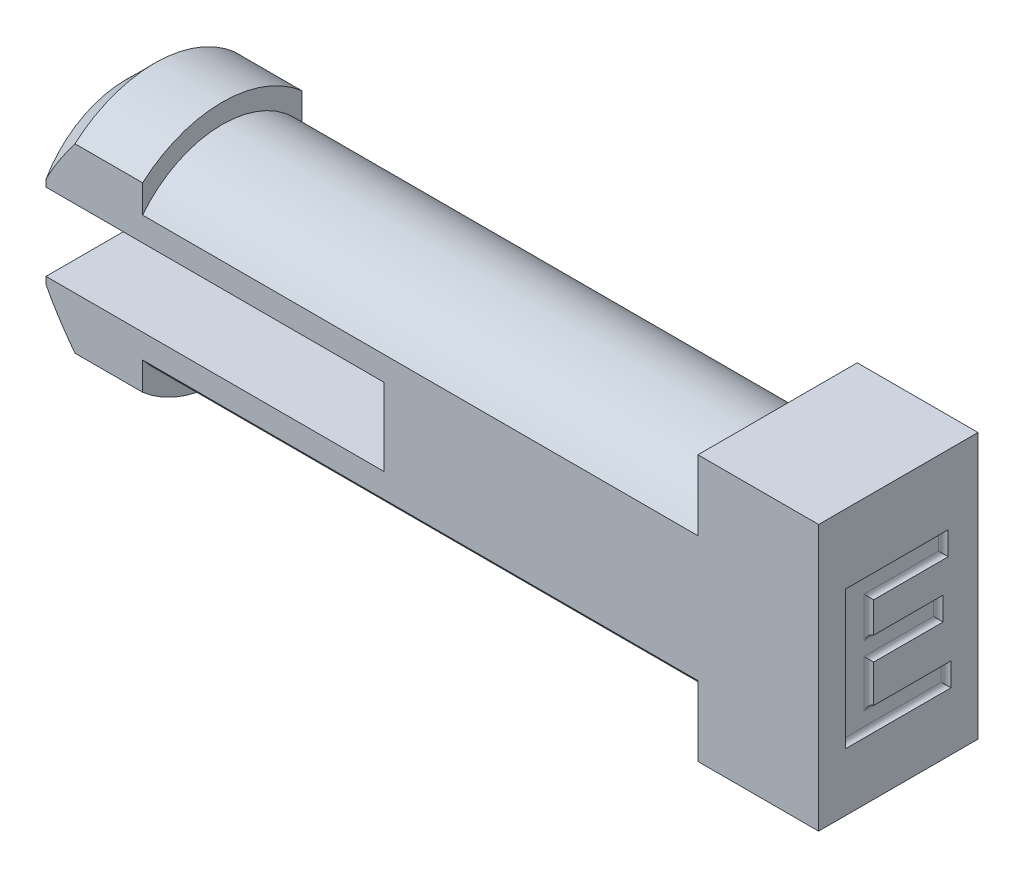
ISO-10303-21;
HEADER;
FILE_DESCRIPTION(('STEP AP214'),'2;1');
FILE_NAME('part.step','',(''),(''),'','','');
FILE_SCHEMA(('AUTOMOTIVE_DESIGN { 1 0 10303 214 1 1 1 1 }'));
ENDSEC;
DATA;
#1=APPLICATION_CONTEXT('core data for automotive mechanical design processes');
#2=APPLICATION_PROTOCOL_DEFINITION('international standard','automotive_design',2000,#1);
#3=PRODUCT_CONTEXT('',#1,'mechanical');
#4=PRODUCT('Part','Part','',(#3));
#5=PRODUCT_RELATED_PRODUCT_CATEGORY('part','',(#4));
#6=PRODUCT_DEFINITION_FORMATION('','',#4);
#7=PRODUCT_DEFINITION_CONTEXT('part definition',#1,'design');
#8=PRODUCT_DEFINITION('design','',#6,#7);
#9=PRODUCT_DEFINITION_SHAPE('','',#8);
#10=(LENGTH_UNIT() NAMED_UNIT(*) SI_UNIT(.MILLI.,.METRE.));
#11=(NAMED_UNIT(*) PLANE_ANGLE_UNIT() SI_UNIT($,.RADIAN.));
#12=(NAMED_UNIT(*) SI_UNIT($,.STERADIAN.) SOLID_ANGLE_UNIT());
#13=UNCERTAINTY_MEASURE_WITH_UNIT(LENGTH_MEASURE(1.E-05),#10,'distance_accuracy_value','');
#14=(GEOMETRIC_REPRESENTATION_CONTEXT(3) GLOBAL_UNCERTAINTY_ASSIGNED_CONTEXT((#13)) GLOBAL_UNIT_ASSIGNED_CONTEXT((#10,
#11,#12)) REPRESENTATION_CONTEXT('',''));
#15=CARTESIAN_POINT('',(0.,0.,0.));
#16=DIRECTION('',(0.,0.,1.));
#17=DIRECTION('',(1.,0.,0.));
#18=AXIS2_PLACEMENT_3D('',#15,#16,#17);
#19=CARTESIAN_POINT('',(4.89000000000003,-2.75,0.));
#20=DIRECTION('',(0.,-1.,0.));
#21=DIRECTION('',(-1.,0.,0.));
#22=AXIS2_PLACEMENT_3D('',#19,#20,#21);
#23=PLANE('',#22);
#24=DIRECTION('',(1.,0.,0.));
#25=VECTOR('',#24,1.);
#26=CARTESIAN_POINT('',(5.50000000000003,-2.75,1.65000000000001));
#27=LINE('',#26,#25);
#28=CARTESIAN_POINT('',(5.50000000000003,-2.75,1.65000000000001));
#29=VERTEX_POINT('',#28);
#30=CARTESIAN_POINT('',(8.00000000000003,-2.75,1.65000000000001));
#31=VERTEX_POINT('',#30);
#32=EDGE_CURVE('E25',#29,#31,#27,.T.);
#33=ORIENTED_EDGE('',*,*,#32,.F.);
#34=DIRECTION('',(0.,0.,1.));
#35=VECTOR('',#34,1.);
#36=CARTESIAN_POINT('',(5.50000000000003,-2.75,-1.65));
#37=LINE('',#36,#35);
#38=CARTESIAN_POINT('',(5.50000000000003,-2.75,-1.65000000000002));
#39=VERTEX_POINT('',#38);
#40=EDGE_CURVE('E360',#39,#29,#37,.T.);
#41=ORIENTED_EDGE('',*,*,#40,.F.);
#42=DIRECTION('',(-1.,0.,0.));
#43=VECTOR('',#42,1.);
#44=CARTESIAN_POINT('',(8.00000000000003,-2.75,-1.65));
#45=LINE('',#44,#43);
#46=CARTESIAN_POINT('',(8.00000000000003,-2.75,-1.64999999999999));
#47=VERTEX_POINT('',#46);
#48=EDGE_CURVE('E11',#47,#39,#45,.T.);
#49=ORIENTED_EDGE('',*,*,#48,.F.);
#50=DIRECTION('',(0.,0.,-1.));
#51=VECTOR('',#50,1.);
#52=CARTESIAN_POINT('',(8.00000000000003,-2.75,1.65000000000001));
#53=LINE('',#52,#51);
#54=EDGE_CURVE('E330',#31,#47,#53,.T.);
#55=ORIENTED_EDGE('',*,*,#54,.F.);
#56=EDGE_LOOP('',(#33,#41,#49,#55));
#57=FACE_BOUND('',#56,.T.);
#58=ADVANCED_FACE('F17',(#57),#23,.T.);
#59=CARTESIAN_POINT('',(0.,-3.66,-1.64999999999999));
#60=DIRECTION('',(0.,0.,-1.));
#61=DIRECTION('',(0.,-1.,0.));
#62=AXIS2_PLACEMENT_3D('',#59,#60,#61);
#63=PLANE('',#62);
#64=DIRECTION('',(1.,0.,0.));
#65=VECTOR('',#64,1.);
#66=CARTESIAN_POINT('',(-7.99999999999997,0.799999999999995,-1.65));
#67=LINE('',#66,#65);
#68=CARTESIAN_POINT('',(-7.99999999999997,0.799999999999995,-1.65));
#69=VERTEX_POINT('',#68);
#70=CARTESIAN_POINT('',(-0.999999999999973,0.799999999999995,-1.65));
#71=VERTEX_POINT('',#70);
#72=EDGE_CURVE('E470',#69,#71,#67,.T.);
#73=ORIENTED_EDGE('',*,*,#72,.F.);
#74=DIRECTION('',(0.,-1.,0.));
#75=VECTOR('',#74,1.);
#76=CARTESIAN_POINT('',(-7.99999999999997,0.9420721840709,-1.64999999999999));
#77=LINE('',#76,#75);
#78=CARTESIAN_POINT('',(-7.99999999999997,0.9420721840709,-1.64999999999998));
#79=VERTEX_POINT('',#78);
#80=EDGE_CURVE('E327',#79,#69,#77,.T.);
#81=ORIENTED_EDGE('',*,*,#80,.F.);
#82=CARTESIAN_POINT('',(-7.39999999999989,1.87816399709923,-1.64999999999999));
#83=CARTESIAN_POINT('',(-7.79957589572927,1.34629364878759,-1.64999999999999));
#84=CARTESIAN_POINT('',(-7.99999999999988,0.942072184070898,-1.64999999999999));
#85=(BOUNDED_CURVE() B_SPLINE_CURVE(2,(#82,#83,#84),.UNSPECIFIED.,.F.,
.F.) B_SPLINE_CURVE_WITH_KNOTS((3,3),(1.2921722792047,1.81390868509701),
.UNSPECIFIED.) CURVE() GEOMETRIC_REPRESENTATION_ITEM() RATIONAL_B_SPLINE_CURVE((4.95180722891681,
5.47938031237729,5.78873239436788)) REPRESENTATION_ITEM(''));
#86=CARTESIAN_POINT('',(-7.39999999999996,1.87816399709931,-1.64999999999999));
#87=VERTEX_POINT('',#86);
#88=EDGE_CURVE('E521',#87,#79,#85,.T.);
#89=ORIENTED_EDGE('',*,*,#88,.F.);
#90=DIRECTION('',(-1.,0.,0.));
#91=VECTOR('',#90,1.);
#92=CARTESIAN_POINT('',(-5.99999999999996,1.87816399709931,-1.65));
#93=LINE('',#92,#91);
#94=CARTESIAN_POINT('',(-5.99999999999996,1.87816399709931,-1.65));
#95=VERTEX_POINT('',#94);
#96=EDGE_CURVE('E552',#95,#87,#93,.T.);
#97=ORIENTED_EDGE('',*,*,#96,.F.);
#98=DIRECTION('',(0.,1.,0.));
#99=VECTOR('',#98,1.);
#100=CARTESIAN_POINT('',(-5.99999999999996,1.29903810567671,-1.64999999999999));
#101=LINE('',#100,#99);
#102=CARTESIAN_POINT('',(-5.99999999999996,1.29903810567671,-1.64999999999999));
#103=VERTEX_POINT('',#102);
#104=EDGE_CURVE('E308',#103,#95,#101,.T.);
#105=ORIENTED_EDGE('',*,*,#104,.F.);
#106=DIRECTION('',(-1.,0.,0.));
#107=VECTOR('',#106,1.);
#108=CARTESIAN_POINT('',(5.50000000000003,1.29903810567671,-1.64999999999998));
#109=LINE('',#108,#107);
#110=CARTESIAN_POINT('',(5.50000000000003,1.29903810567671,-1.64999999999998));
#111=VERTEX_POINT('',#110);
#112=EDGE_CURVE('E294',#111,#103,#109,.T.);
#113=ORIENTED_EDGE('',*,*,#112,.F.);
#114=DIRECTION('',(0.,-1.,0.));
#115=VECTOR('',#114,1.);
#116=CARTESIAN_POINT('',(5.50000000000003,2.75,-1.65));
#117=LINE('',#116,#115);
#118=CARTESIAN_POINT('',(5.50000000000003,2.75,-1.64999999999999));
#119=VERTEX_POINT('',#118);
#120=EDGE_CURVE('E525',#119,#111,#117,.T.);
#121=ORIENTED_EDGE('',*,*,#120,.F.);
#122=DIRECTION('',(-1.,0.,0.));
#123=VECTOR('',#122,1.);
#124=CARTESIAN_POINT('',(8.00000000000003,2.75,-1.64999999999999));
#125=LINE('',#124,#123);
#126=CARTESIAN_POINT('',(8.00000000000003,2.75,-1.64999999999999));
#127=VERTEX_POINT('',#126);
#128=EDGE_CURVE('E381',#127,#119,#125,.T.);
#129=ORIENTED_EDGE('',*,*,#128,.F.);
#130=DIRECTION('',(0.,1.,0.));
#131=VECTOR('',#130,1.);
#132=CARTESIAN_POINT('',(8.00000000000003,-2.75,-1.64999999999999));
#133=LINE('',#132,#131);
#134=EDGE_CURVE('E350',#47,#127,#133,.T.);
#135=ORIENTED_EDGE('',*,*,#134,.F.);
#136=ORIENTED_EDGE('',*,*,#48,.T.);
#137=DIRECTION('',(0.,-1.,0.));
#138=VECTOR('',#137,1.);
#139=CARTESIAN_POINT('',(5.50000000000003,-1.29903810567659,-1.65000000000002));
#140=LINE('',#139,#138);
#141=CARTESIAN_POINT('',(5.50000000000003,-1.29903810567659,-1.65000000000004));
#142=VERTEX_POINT('',#141);
#143=EDGE_CURVE('E347',#142,#39,#140,.T.);
#144=ORIENTED_EDGE('',*,*,#143,.F.);
#145=DIRECTION('',(1.,0.,0.));
#146=VECTOR('',#145,1.);
#147=CARTESIAN_POINT('',(-5.99999999999996,-1.29903810567659,-1.65000000000004));
#148=LINE('',#147,#146);
#149=CARTESIAN_POINT('',(-5.99999999999996,-1.29903810567659,-1.64999999999999));
#150=VERTEX_POINT('',#149);
#151=EDGE_CURVE('E336',#150,#142,#148,.T.);
#152=ORIENTED_EDGE('',*,*,#151,.F.);
#153=DIRECTION('',(0.,1.,0.));
#154=VECTOR('',#153,1.);
#155=CARTESIAN_POINT('',(-5.99999999999996,-1.87816399709929,-1.64999999999999));
#156=LINE('',#155,#154);
#157=CARTESIAN_POINT('',(-5.99999999999996,-1.87816399709929,-1.64999999999999));
#158=VERTEX_POINT('',#157);
#159=EDGE_CURVE('E537',#158,#150,#156,.T.);
#160=ORIENTED_EDGE('',*,*,#159,.F.);
#161=DIRECTION('',(1.,0.,0.));
#162=VECTOR('',#161,1.);
#163=CARTESIAN_POINT('',(-7.39999999999996,-1.87816399709929,-1.64999999999999));
#164=LINE('',#163,#162);
#165=CARTESIAN_POINT('',(-7.39999999999996,-1.87816399709929,-1.64999999999999));
#166=VERTEX_POINT('',#165);
#167=EDGE_CURVE('E315',#166,#158,#164,.T.);
#168=ORIENTED_EDGE('',*,*,#167,.F.);
#169=CARTESIAN_POINT('',(-7.99999999999988,-0.942072184070796,-1.64999999999999));
#170=CARTESIAN_POINT('',(-7.83409436333462,-1.2766757473581,-1.64999999999999));
#171=CARTESIAN_POINT('',(-7.4714965307737,-1.78299588227487,-1.64999999999999));
#172=CARTESIAN_POINT('',(-7.39999999999977,-1.87816399709917,-1.64999999999999));
#173=(BOUNDED_CURVE() B_SPLINE_CURVE(2,(#169,#170,#171,#172),.UNSPECIFIED.,.F.,
.F.) B_SPLINE_CURVE_WITH_KNOTS((3,1,3),(3.29314526018288,3.72903639533109,3.81488166607523),
.UNSPECIFIED.) CURVE() GEOMETRIC_REPRESENTATION_ITEM() RATIONAL_B_SPLINE_CURVE((5.78873239436792,
5.53028037021079,5.03861285274427,4.95180722891679)) REPRESENTATION_ITEM(''));
#174=CARTESIAN_POINT('',(-7.99999999999997,-0.942072184070802,-1.65000000000001));
#175=VERTEX_POINT('',#174);
#176=EDGE_CURVE('E477',#175,#166,#173,.T.);
#177=ORIENTED_EDGE('',*,*,#176,.F.);
#178=DIRECTION('',(0.,-1.,0.));
#179=VECTOR('',#178,1.);
#180=CARTESIAN_POINT('',(-7.99999999999997,-0.799999999999995,-1.64999999999999));
#181=LINE('',#180,#179);
#182=CARTESIAN_POINT('',(-7.99999999999997,-0.799999999999995,-1.64999999999999));
#183=VERTEX_POINT('',#182);
#184=EDGE_CURVE('E544',#183,#175,#181,.T.);
#185=ORIENTED_EDGE('',*,*,#184,.F.);
#186=DIRECTION('',(-1.,0.,0.));
#187=VECTOR('',#186,1.);
#188=CARTESIAN_POINT('',(-0.999999999999973,-0.799999999999995,-1.65));
#189=LINE('',#188,#187);
#190=CARTESIAN_POINT('',(-0.999999999999973,-0.799999999999995,-1.65));
#191=VERTEX_POINT('',#190);
#192=EDGE_CURVE('E457',#191,#183,#189,.T.);
#193=ORIENTED_EDGE('',*,*,#192,.F.);
#194=DIRECTION('',(0.,-1.,0.));
#195=VECTOR('',#194,1.);
#196=CARTESIAN_POINT('',(-0.999999999999973,0.799999999999995,-1.65));
#197=LINE('',#196,#195);
#198=EDGE_CURVE('E448',#71,#191,#197,.T.);
#199=ORIENTED_EDGE('',*,*,#198,.F.);
#200=EDGE_LOOP('',(#73,#81,#89,#97,#105,#113,#121,#129,#135,#136,#144,#152,#160,#168,#177,#185,
#193,#199));
#201=FACE_BOUND('',#200,.T.);
#202=ADVANCED_FACE('F582',(#201),#63,.T.);
#203=CARTESIAN_POINT('',(0.,-3.66,1.65000000000001));
#204=DIRECTION('',(0.,0.,1.));
#205=DIRECTION('',(0.,-1.,0.));
#206=AXIS2_PLACEMENT_3D('',#203,#204,#205);
#207=PLANE('',#206);
#208=DIRECTION('',(-1.,0.,0.));
#209=VECTOR('',#208,1.);
#210=CARTESIAN_POINT('',(-0.999999999999973,0.799999999999995,1.65000000000001));
#211=LINE('',#210,#209);
#212=CARTESIAN_POINT('',(-0.999999999999973,0.799999999999995,1.65000000000001));
#213=VERTEX_POINT('',#212);
#214=CARTESIAN_POINT('',(-7.99999999999997,0.799999999999995,1.65000000000001));
#215=VERTEX_POINT('',#214);
#216=EDGE_CURVE('E469',#213,#215,#211,.T.);
#217=ORIENTED_EDGE('',*,*,#216,.F.);
#218=DIRECTION('',(0.,1.,0.));
#219=VECTOR('',#218,1.);
#220=CARTESIAN_POINT('',(-0.999999999999973,-0.799999999999995,1.65000000000001));
#221=LINE('',#220,#219);
#222=CARTESIAN_POINT('',(-0.999999999999973,-0.799999999999995,1.65000000000001));
#223=VERTEX_POINT('',#222);
#224=EDGE_CURVE('E423',#223,#213,#221,.T.);
#225=ORIENTED_EDGE('',*,*,#224,.F.);
#226=DIRECTION('',(1.,0.,0.));
#227=VECTOR('',#226,1.);
#228=CARTESIAN_POINT('',(-7.99999999999997,-0.799999999999995,1.65000000000001));
#229=LINE('',#228,#227);
#230=CARTESIAN_POINT('',(-7.99999999999997,-0.799999999999995,1.65000000000001));
#231=VERTEX_POINT('',#230);
#232=EDGE_CURVE('E419',#231,#223,#229,.T.);
#233=ORIENTED_EDGE('',*,*,#232,.F.);
#234=DIRECTION('',(0.,1.,0.));
#235=VECTOR('',#234,1.);
#236=CARTESIAN_POINT('',(-7.99999999999997,-0.942072184070802,1.65000000000002));
#237=LINE('',#236,#235);
#238=CARTESIAN_POINT('',(-7.99999999999997,-0.942072184070802,1.65000000000003));
#239=VERTEX_POINT('',#238);
#240=EDGE_CURVE('E547',#239,#231,#237,.T.);
#241=ORIENTED_EDGE('',*,*,#240,.F.);
#242=CARTESIAN_POINT('',(-7.39999999999984,-1.87816399709911,1.64999999999999));
#243=CARTESIAN_POINT('',(-7.79957589572942,-1.34629364878745,1.64999999999998));
#244=CARTESIAN_POINT('',(-8.00000000000001,-0.942072184070663,1.64999999999999));
#245=(BOUNDED_CURVE() B_SPLINE_CURVE(2,(#242,#243,#244),.UNSPECIFIED.,.F.,
.F.) B_SPLINE_CURVE_WITH_KNOTS((3,3),(1.29217227920472,1.8139086850971),
.UNSPECIFIED.) CURVE() GEOMETRIC_REPRESENTATION_ITEM() RATIONAL_B_SPLINE_CURVE((4.95180722891684,
5.47938031237738,5.78873239436797)) REPRESENTATION_ITEM(''));
#246=CARTESIAN_POINT('',(-7.39999999999996,-1.87816399709929,1.65000000000003));
#247=VERTEX_POINT('',#246);
#248=EDGE_CURVE('E492',#247,#239,#245,.T.);
#249=ORIENTED_EDGE('',*,*,#248,.F.);
#250=DIRECTION('',(-1.,0.,0.));
#251=VECTOR('',#250,1.);
#252=CARTESIAN_POINT('',(-5.99999999999996,-1.8781639970992,1.65000000000002));
#253=LINE('',#252,#251);
#254=CARTESIAN_POINT('',(-5.99999999999996,-1.87816399709929,1.65000000000003));
#255=VERTEX_POINT('',#254);
#256=EDGE_CURVE('E319',#255,#247,#253,.T.);
#257=ORIENTED_EDGE('',*,*,#256,.F.);
#258=DIRECTION('',(0.,-1.,0.));
#259=VECTOR('',#258,1.);
#260=CARTESIAN_POINT('',(-5.99999999999996,-1.29903810567659,1.65000000000003));
#261=LINE('',#260,#259);
#262=CARTESIAN_POINT('',(-5.99999999999996,-1.29903810567659,1.65000000000003));
#263=VERTEX_POINT('',#262);
#264=EDGE_CURVE('E530',#263,#255,#261,.T.);
#265=ORIENTED_EDGE('',*,*,#264,.F.);
#266=DIRECTION('',(-1.,0.,0.));
#267=VECTOR('',#266,1.);
#268=CARTESIAN_POINT('',(5.50000000000003,-1.29903810567659,1.65000000000004));
#269=LINE('',#268,#267);
#270=CARTESIAN_POINT('',(5.50000000000003,-1.29903810567659,1.65000000000004));
#271=VERTEX_POINT('',#270);
#272=EDGE_CURVE('E334',#271,#263,#269,.T.);
#273=ORIENTED_EDGE('',*,*,#272,.F.);
#274=DIRECTION('',(0.,1.,0.));
#275=VECTOR('',#274,1.);
#276=CARTESIAN_POINT('',(5.50000000000003,-2.75,1.65000000000001));
#277=LINE('',#276,#275);
#278=EDGE_CURVE('E125',#29,#271,#277,.T.);
#279=ORIENTED_EDGE('',*,*,#278,.F.);
#280=ORIENTED_EDGE('',*,*,#32,.T.);
#281=DIRECTION('',(0.,-1.,0.));
#282=VECTOR('',#281,1.);
#283=CARTESIAN_POINT('',(8.00000000000003,2.75,1.65000000000001));
#284=LINE('',#283,#282);
#285=CARTESIAN_POINT('',(8.00000000000003,2.75,1.65000000000001));
#286=VERTEX_POINT('',#285);
#287=EDGE_CURVE('E322',#286,#31,#284,.T.);
#288=ORIENTED_EDGE('',*,*,#287,.F.);
#289=DIRECTION('',(1.,0.,0.));
#290=VECTOR('',#289,1.);
#291=CARTESIAN_POINT('',(5.50000000000003,2.75,1.65000000000001));
#292=LINE('',#291,#290);
#293=CARTESIAN_POINT('',(5.50000000000003,2.75,1.65000000000001));
#294=VERTEX_POINT('',#293);
#295=EDGE_CURVE('E379',#294,#286,#292,.T.);
#296=ORIENTED_EDGE('',*,*,#295,.F.);
#297=DIRECTION('',(0.,1.,0.));
#298=VECTOR('',#297,1.);
#299=CARTESIAN_POINT('',(5.50000000000003,1.29903810567671,1.65));
#300=LINE('',#299,#298);
#301=CARTESIAN_POINT('',(5.50000000000003,1.29903810567671,1.64999999999998));
#302=VERTEX_POINT('',#301);
#303=EDGE_CURVE('E107',#302,#294,#300,.T.);
#304=ORIENTED_EDGE('',*,*,#303,.F.);
#305=DIRECTION('',(1.,0.,0.));
#306=VECTOR('',#305,1.);
#307=CARTESIAN_POINT('',(-5.99999999999996,1.29903810567671,1.64999999999998));
#308=LINE('',#307,#306);
#309=CARTESIAN_POINT('',(-5.99999999999996,1.29903810567671,1.65));
#310=VERTEX_POINT('',#309);
#311=EDGE_CURVE('E283',#310,#302,#308,.T.);
#312=ORIENTED_EDGE('',*,*,#311,.F.);
#313=DIRECTION('',(0.,-1.,0.));
#314=VECTOR('',#313,1.);
#315=CARTESIAN_POINT('',(-5.99999999999996,1.87816399709931,1.65));
#316=LINE('',#315,#314);
#317=CARTESIAN_POINT('',(-5.99999999999996,1.87816399709931,1.64999999999999));
#318=VERTEX_POINT('',#317);
#319=EDGE_CURVE('E288',#318,#310,#316,.T.);
#320=ORIENTED_EDGE('',*,*,#319,.F.);
#321=DIRECTION('',(1.,0.,0.));
#322=VECTOR('',#321,1.);
#323=CARTESIAN_POINT('',(-7.39999999999996,1.87816399709931,1.64999999999999));
#324=LINE('',#323,#322);
#325=CARTESIAN_POINT('',(-7.39999999999996,1.87816399709931,1.65));
#326=VERTEX_POINT('',#325);
#327=EDGE_CURVE('E551',#326,#318,#324,.T.);
#328=ORIENTED_EDGE('',*,*,#327,.F.);
#329=CARTESIAN_POINT('',(-7.9999999999998,0.94207218407103,1.64999999999999));
#330=CARTESIAN_POINT('',(-7.83409436333447,1.27667574735836,1.64999999999999));
#331=CARTESIAN_POINT('',(-7.4714965307737,1.78299588227501,1.64999999999999));
#332=CARTESIAN_POINT('',(-7.39999999999977,1.87816399709924,1.64999999999999));
#333=(BOUNDED_CURVE() B_SPLINE_CURVE(2,(#329,#330,#331,#332),.UNSPECIFIED.,.F.,
.F.) B_SPLINE_CURVE_WITH_KNOTS((3,1,3),(3.29314526018298,3.72903639533109,3.81488166607526),
.UNSPECIFIED.) CURVE() GEOMETRIC_REPRESENTATION_ITEM() RATIONAL_B_SPLINE_CURVE((5.78873239436778,
5.53028037021068,5.03861285274423,4.95180722891673)) REPRESENTATION_ITEM(''));
#334=CARTESIAN_POINT('',(-7.99999999999997,0.9420721840709,1.64999999999998));
#335=VERTEX_POINT('',#334);
#336=EDGE_CURVE('E506',#335,#326,#333,.T.);
#337=ORIENTED_EDGE('',*,*,#336,.F.);
#338=DIRECTION('',(0.,1.,0.));
#339=VECTOR('',#338,1.);
#340=CARTESIAN_POINT('',(-7.99999999999997,0.799999999999995,1.65000000000001));
#341=LINE('',#340,#339);
#342=EDGE_CURVE('E524',#215,#335,#341,.T.);
#343=ORIENTED_EDGE('',*,*,#342,.F.);
#344=EDGE_LOOP('',(#217,#225,#233,#241,#249,#257,#265,#273,#279,#280,#288,#296,#304,#312,#320,
#328,#337,#343));
#345=FACE_BOUND('',#344,.T.);
#346=ADVANCED_FACE('F286',(#345),#207,.T.);
#347=CARTESIAN_POINT('',(5.50000000000003,-2.02451905283829,-2.34000000000002));
#348=DIRECTION('',(-1.,0.,0.));
#349=DIRECTION('',(0.,0.,1.));
#350=AXIS2_PLACEMENT_3D('',#347,#348,#349);
#351=PLANE('',#350);
#352=ORIENTED_EDGE('',*,*,#143,.T.);
#353=ORIENTED_EDGE('',*,*,#40,.T.);
#354=ORIENTED_EDGE('',*,*,#278,.T.);
#355=CARTESIAN_POINT('',(5.50000000000003,0.,0.));
#356=DIRECTION('',(-1.,0.,0.));
#357=DIRECTION('',(0.,-0.618589574131717,0.785714285714305));
#358=AXIS2_PLACEMENT_3D('',#355,#356,#357);
#359=CIRCLE('',#358,2.1);
#360=EDGE_CURVE('E304',#142,#271,#359,.T.);
#361=ORIENTED_EDGE('',*,*,#360,.F.);
#362=EDGE_LOOP('',(#352,#353,#354,#361));
#363=FACE_BOUND('',#362,.T.);
#364=ADVANCED_FACE('F587',(#363),#351,.T.);
#365=CARTESIAN_POINT('',(8.00000000000003,0.,-2.33999999999999));
#366=DIRECTION('',(1.,0.,0.));
#367=DIRECTION('',(0.,-1.,0.));
#368=AXIS2_PLACEMENT_3D('',#365,#366,#367);
#369=PLANE('',#368);
#370=DIRECTION('',(0.,-1.,0.));
#371=VECTOR('',#370,1.);
#372=CARTESIAN_POINT('',(8.00000000000003,-0.533193014546296,-1.08831012884507));
#373=LINE('',#372,#371);
#374=CARTESIAN_POINT('',(8.00000000000003,-1.06638602909269,-1.08831012884507));
#375=VERTEX_POINT('',#374);
#376=CARTESIAN_POINT('',(8.00000000000003,-1.5488078444881,-1.08831012884507));
#377=VERTEX_POINT('',#376);
#378=EDGE_CURVE('E364',#375,#377,#373,.T.);
#379=ORIENTED_EDGE('',*,*,#378,.T.);
#380=DIRECTION('',(0.,0.,1.));
#381=VECTOR('',#380,1.);
#382=CARTESIAN_POINT('',(8.00000000000003,-1.5488078444881,-1.71415506442253));
#383=LINE('',#382,#381);
#384=CARTESIAN_POINT('',(8.00000000000003,-1.5488078444881,1.08942426478139));
#385=VERTEX_POINT('',#384);
#386=EDGE_CURVE('E370',#377,#385,#383,.T.);
#387=ORIENTED_EDGE('',*,*,#386,.T.);
#388=DIRECTION('',(0.,1.,0.));
#389=VECTOR('',#388,1.);
#390=CARTESIAN_POINT('',(8.00000000000003,-0.774403922243996,1.08942426478139));
#391=LINE('',#390,#389);
#392=CARTESIAN_POINT('',(8.00000000000003,1.31447352472121,1.08942426478139));
#393=VERTEX_POINT('',#392);
#394=EDGE_CURVE('E384',#385,#393,#391,.T.);
#395=ORIENTED_EDGE('',*,*,#394,.T.);
#396=DIRECTION('',(0.,0.,-1.));
#397=VECTOR('',#396,1.);
#398=CARTESIAN_POINT('',(8.00000000000003,1.31447352472121,-0.625287867609304));
#399=LINE('',#398,#397);
#400=CARTESIAN_POINT('',(8.00000000000003,1.31447352472121,-1.03362256924042));
#401=VERTEX_POINT('',#400);
#402=EDGE_CURVE('E400',#393,#401,#399,.T.);
#403=ORIENTED_EDGE('',*,*,#402,.T.);
#404=DIRECTION('',(0.,-1.,0.));
#405=VECTOR('',#404,1.);
#406=CARTESIAN_POINT('',(8.00000000000003,0.657236762360597,-1.03362256924042));
#407=LINE('',#406,#405);
#408=CARTESIAN_POINT('',(8.00000000000003,0.830098465116613,-1.03362256924042));
#409=VERTEX_POINT('',#408);
#410=EDGE_CURVE('E401',#401,#409,#407,.T.);
#411=ORIENTED_EDGE('',*,*,#410,.T.);
#412=DIRECTION('',(0.,0.,1.));
#413=VECTOR('',#412,1.);
#414=CARTESIAN_POINT('',(8.00000000000003,0.830098465116613,-1.68681128462021));
#415=LINE('',#414,#413);
#416=CARTESIAN_POINT('',(8.00000000000003,0.830098465116613,0.511299275957258));
#417=VERTEX_POINT('',#416);
#418=EDGE_CURVE('E414',#409,#417,#415,.T.);
#419=ORIENTED_EDGE('',*,*,#418,.T.);
#420=DIRECTION('',(0.,-1.,0.));
#421=VECTOR('',#420,1.);
#422=CARTESIAN_POINT('',(8.00000000000003,0.415049232558307,0.511299275957258));
#423=LINE('',#422,#421);
#424=CARTESIAN_POINT('',(8.00000000000003,0.195332840116608,0.511299275957258));
#425=VERTEX_POINT('',#424);
#426=EDGE_CURVE('E433',#417,#425,#423,.T.);
#427=ORIENTED_EDGE('',*,*,#426,.T.);
#428=DIRECTION('',(0.,0.,-1.));
#429=VECTOR('',#428,1.);
#430=CARTESIAN_POINT('',(8.00000000000003,0.195332840116608,-0.914350362021368));
#431=LINE('',#430,#429);
#432=CARTESIAN_POINT('',(8.00000000000003,0.195332840116608,-0.926200694240421));
#433=VERTEX_POINT('',#432);
#434=EDGE_CURVE('E443',#425,#433,#431,.T.);
#435=ORIENTED_EDGE('',*,*,#434,.T.);
#436=DIRECTION('',(0.,-1.,0.));
#437=VECTOR('',#436,1.);
#438=CARTESIAN_POINT('',(8.00000000000003,0.0976664200583038,-0.926200694240421));
#439=LINE('',#438,#437);
#440=CARTESIAN_POINT('',(8.00000000000003,-0.287089124290388,-0.926200694240421));
#441=VERTEX_POINT('',#440);
#442=EDGE_CURVE('E1132',#433,#441,#439,.T.);
#443=ORIENTED_EDGE('',*,*,#442,.T.);
#444=DIRECTION('',(0.,0.,1.));
#445=VECTOR('',#444,1.);
#446=CARTESIAN_POINT('',(8.00000000000003,-0.287089124290388,-1.63310034712021));
#447=LINE('',#446,#445);
#448=CARTESIAN_POINT('',(8.00000000000003,-0.287089124290388,0.511299275957258));
#449=VERTEX_POINT('',#448);
#450=EDGE_CURVE('E1161',#441,#449,#447,.T.);
#451=ORIENTED_EDGE('',*,*,#450,.T.);
#452=DIRECTION('',(0.,-1.,0.));
#453=VECTOR('',#452,1.);
#454=CARTESIAN_POINT('',(8.00000000000003,-0.143544562145201,0.511299275957258));
#455=LINE('',#454,#453);
#456=CARTESIAN_POINT('',(8.00000000000003,-1.06638602909269,0.511299275957258));
#457=VERTEX_POINT('',#456);
#458=EDGE_CURVE('E1183',#449,#457,#455,.T.);
#459=ORIENTED_EDGE('',*,*,#458,.T.);
#460=DIRECTION('',(0.,0.,-1.));
#461=VECTOR('',#460,1.);
#462=CARTESIAN_POINT('',(8.00000000000003,-1.06638602909269,-0.914350362021368));
#463=LINE('',#462,#461);
#464=EDGE_CURVE('E1202',#457,#375,#463,.T.);
#465=ORIENTED_EDGE('',*,*,#464,.T.);
#466=EDGE_LOOP('',(#379,#387,#395,#403,#411,#419,#427,#435,#443,#451,#459,#465));
#467=FACE_BOUND('',#466,.T.);
#468=DIRECTION('',(0.,0.,-1.));
#469=VECTOR('',#468,1.);
#470=CARTESIAN_POINT('',(8.00000000000003,2.75,1.65000000000001));
#471=LINE('',#470,#469);
#472=EDGE_CURVE('E564',#286,#127,#471,.T.);
#473=ORIENTED_EDGE('',*,*,#472,.F.);
#474=ORIENTED_EDGE('',*,*,#287,.T.);
#475=ORIENTED_EDGE('',*,*,#54,.T.);
#476=ORIENTED_EDGE('',*,*,#134,.T.);
#477=EDGE_LOOP('',(#473,#474,#475,#476));
#478=FACE_BOUND('',#477,.T.);
#479=ADVANCED_FACE('F595',(#467,#478),#369,.T.);
#480=CARTESIAN_POINT('',(-7.99999999999997,1.35000000000012,-2.34));
#481=DIRECTION('',(-1.,0.,0.));
#482=DIRECTION('',(0.,0.,1.));
#483=AXIS2_PLACEMENT_3D('',#480,#481,#482);
#484=PLANE('',#483);
#485=DIRECTION('',(0.,0.,-1.));
#486=VECTOR('',#485,1.);
#487=CARTESIAN_POINT('',(-7.99999999999997,0.799999999999995,1.65000000000001));
#488=LINE('',#487,#486);
#489=EDGE_CURVE('E475',#215,#69,#488,.T.);
#490=ORIENTED_EDGE('',*,*,#489,.F.);
#491=ORIENTED_EDGE('',*,*,#342,.T.);
#492=CARTESIAN_POINT('',(-7.99999999999997,0.,0.));
#493=DIRECTION('',(1.,0.,0.));
#494=DIRECTION('',(0.,0.49582746530048,0.868421052631557));
#495=AXIS2_PLACEMENT_3D('',#492,#493,#494);
#496=CIRCLE('',#495,1.9);
#497=EDGE_CURVE('E513',#79,#335,#496,.T.);
#498=ORIENTED_EDGE('',*,*,#497,.F.);
#499=ORIENTED_EDGE('',*,*,#80,.T.);
#500=EDGE_LOOP('',(#490,#491,#498,#499));
#501=FACE_BOUND('',#500,.T.);
#502=ADVANCED_FACE('F597',(#501),#484,.T.);
#503=CARTESIAN_POINT('',(5.50000000000003,2.0245190528384,-2.34));
#504=DIRECTION('',(-1.,0.,0.));
#505=DIRECTION('',(0.,0.,1.));
#506=AXIS2_PLACEMENT_3D('',#503,#504,#505);
#507=PLANE('',#506);
#508=ORIENTED_EDGE('',*,*,#303,.T.);
#509=DIRECTION('',(0.,0.,1.));
#510=VECTOR('',#509,1.);
#511=CARTESIAN_POINT('',(5.50000000000003,2.75,-1.65));
#512=LINE('',#511,#510);
#513=EDGE_CURVE('E376',#119,#294,#512,.T.);
#514=ORIENTED_EDGE('',*,*,#513,.F.);
#515=ORIENTED_EDGE('',*,*,#120,.T.);
#516=CARTESIAN_POINT('',(5.50000000000003,0.,0.));
#517=DIRECTION('',(-1.,0.,0.));
#518=DIRECTION('',(0.,0.618589574131748,-0.785714285714281));
#519=AXIS2_PLACEMENT_3D('',#516,#517,#518);
#520=CIRCLE('',#519,2.1);
#521=EDGE_CURVE('E340',#302,#111,#520,.T.);
#522=ORIENTED_EDGE('',*,*,#521,.F.);
#523=EDGE_LOOP('',(#508,#514,#515,#522));
#524=FACE_BOUND('',#523,.T.);
#525=ADVANCED_FACE('F641',(#524),#507,.T.);
#526=CARTESIAN_POINT('',(-7.15119999999997,0.,0.));
#527=DIRECTION('',(-1.,0.,0.));
#528=DIRECTION('',(0.,0.,1.));
#529=AXIS2_PLACEMENT_3D('',#526,#527,#528);
#530=CYLINDRICAL_SURFACE('',#529,2.1);
#531=ORIENTED_EDGE('',*,*,#521,.T.);
#532=ORIENTED_EDGE('',*,*,#112,.T.);
#533=CARTESIAN_POINT('',(-5.99999999999996,0.,0.));
#534=DIRECTION('',(-1.,0.,0.));
#535=DIRECTION('',(0.,0.618589574131768,-0.785714285714265));
#536=AXIS2_PLACEMENT_3D('',#533,#534,#535);
#537=CIRCLE('',#536,2.10000000000004);
#538=EDGE_CURVE('E299',#310,#103,#537,.T.);
#539=ORIENTED_EDGE('',*,*,#538,.F.);
#540=ORIENTED_EDGE('',*,*,#311,.T.);
#541=EDGE_LOOP('',(#531,#532,#539,#540));
#542=FACE_BOUND('',#541,.T.);
#543=ADVANCED_FACE('F306',(#542),#530,.T.);
#544=CARTESIAN_POINT('',(-7.15119999999997,0.,0.));
#545=DIRECTION('',(-1.,0.,0.));
#546=DIRECTION('',(0.,0.,1.));
#547=AXIS2_PLACEMENT_3D('',#544,#545,#546);
#548=CYLINDRICAL_SURFACE('',#547,2.1);
#549=ORIENTED_EDGE('',*,*,#360,.T.);
#550=ORIENTED_EDGE('',*,*,#272,.T.);
#551=CARTESIAN_POINT('',(-5.99999999999996,0.,0.));
#552=DIRECTION('',(-1.,0.,0.));
#553=DIRECTION('',(0.,-0.618589574131703,0.785714285714316));
#554=AXIS2_PLACEMENT_3D('',#551,#552,#553);
#555=CIRCLE('',#554,2.09999999999995);
#556=EDGE_CURVE('E519',#150,#263,#555,.T.);
#557=ORIENTED_EDGE('',*,*,#556,.F.);
#558=ORIENTED_EDGE('',*,*,#151,.T.);
#559=EDGE_LOOP('',(#549,#550,#557,#558));
#560=FACE_BOUND('',#559,.T.);
#561=ADVANCED_FACE('F589',(#560),#548,.T.);
#562=CARTESIAN_POINT('',(-5.99999999999996,2.31337801554152,-2.34));
#563=DIRECTION('',(1.,0.,0.));
#564=DIRECTION('',(0.,-1.,0.));
#565=AXIS2_PLACEMENT_3D('',#562,#563,#564);
#566=PLANE('',#565);
#567=ORIENTED_EDGE('',*,*,#538,.T.);
#568=ORIENTED_EDGE('',*,*,#104,.T.);
#569=CARTESIAN_POINT('',(-5.99999999999996,0.,0.));
#570=DIRECTION('',(-1.,0.,0.));
#571=DIRECTION('',(0.,0.75126559883971,-0.660000000000009));
#572=AXIS2_PLACEMENT_3D('',#569,#570,#571);
#573=CIRCLE('',#572,2.5);
#574=EDGE_CURVE('E305',#318,#95,#573,.T.);
#575=ORIENTED_EDGE('',*,*,#574,.F.);
#576=ORIENTED_EDGE('',*,*,#319,.T.);
#577=EDGE_LOOP('',(#567,#568,#575,#576));
#578=FACE_BOUND('',#577,.T.);
#579=ADVANCED_FACE('F298',(#578),#566,.T.);
#580=CARTESIAN_POINT('',(-7.54119999999997,0.,0.));
#581=DIRECTION('',(-1.,0.,0.));
#582=DIRECTION('',(0.,0.,1.));
#583=AXIS2_PLACEMENT_3D('',#580,#581,#582);
#584=CYLINDRICAL_SURFACE('',#583,2.5);
#585=ORIENTED_EDGE('',*,*,#256,.T.);
#586=CARTESIAN_POINT('',(-7.39999999999996,1.11022302462516E-13,0.));
#587=DIRECTION('',(-1.,0.,0.));
#588=DIRECTION('',(0.,-0.751265598839718,0.66));
#589=AXIS2_PLACEMENT_3D('',#586,#587,#588);
#590=CIRCLE('',#589,2.5);
#591=EDGE_CURVE('E486',#166,#247,#590,.T.);
#592=ORIENTED_EDGE('',*,*,#591,.F.);
#593=ORIENTED_EDGE('',*,*,#167,.T.);
#594=CARTESIAN_POINT('',(-5.99999999999996,0.,0.));
#595=DIRECTION('',(1.,0.,0.));
#596=DIRECTION('',(0.,-0.751265598839721,-0.66));
#597=AXIS2_PLACEMENT_3D('',#594,#595,#596);
#598=CIRCLE('',#597,2.5);
#599=EDGE_CURVE('E531',#255,#158,#598,.T.);
#600=ORIENTED_EDGE('',*,*,#599,.F.);
#601=EDGE_LOOP('',(#585,#592,#593,#600));
#602=FACE_BOUND('',#601,.T.);
#603=ADVANCED_FACE('F573',(#602),#584,.T.);
#604=CARTESIAN_POINT('',(4.89000000000003,2.75,0.));
#605=DIRECTION('',(0.,1.,0.));
#606=DIRECTION('',(1.,0.,0.));
#607=AXIS2_PLACEMENT_3D('',#604,#605,#606);
#608=PLANE('',#607);
#609=ORIENTED_EDGE('',*,*,#128,.T.);
#610=ORIENTED_EDGE('',*,*,#513,.T.);
#611=ORIENTED_EDGE('',*,*,#295,.T.);
#612=ORIENTED_EDGE('',*,*,#472,.T.);
#613=EDGE_LOOP('',(#609,#610,#611,#612));
#614=FACE_BOUND('',#613,.T.);
#615=ADVANCED_FACE('F693',(#614),#608,.T.);
#616=CARTESIAN_POINT('',(-7.54119999999997,0.,0.));
#617=DIRECTION('',(-1.,0.,0.));
#618=DIRECTION('',(0.,0.,1.));
#619=AXIS2_PLACEMENT_3D('',#616,#617,#618);
#620=CYLINDRICAL_SURFACE('',#619,2.5);
#621=ORIENTED_EDGE('',*,*,#96,.T.);
#622=CARTESIAN_POINT('',(-7.39999999999996,0.,0.));
#623=DIRECTION('',(-1.,0.,0.));
#624=DIRECTION('',(0.,0.751265598839726,-0.659999999999991));
#625=AXIS2_PLACEMENT_3D('',#622,#623,#624);
#626=CIRCLE('',#625,2.5);
#627=EDGE_CURVE('E511',#326,#87,#626,.T.);
#628=ORIENTED_EDGE('',*,*,#627,.F.);
#629=ORIENTED_EDGE('',*,*,#327,.T.);
#630=ORIENTED_EDGE('',*,*,#574,.T.);
#631=EDGE_LOOP('',(#621,#628,#629,#630));
#632=FACE_BOUND('',#631,.T.);
#633=ADVANCED_FACE('F701',(#632),#620,.T.);
#634=CARTESIAN_POINT('',(-7.99999999999997,-1.35,-2.34));
#635=DIRECTION('',(-1.,0.,0.));
#636=DIRECTION('',(0.,0.,1.));
#637=AXIS2_PLACEMENT_3D('',#634,#635,#636);
#638=PLANE('',#637);
#639=DIRECTION('',(0.,0.,1.));
#640=VECTOR('',#639,1.);
#641=CARTESIAN_POINT('',(-7.99999999999997,-0.799999999999995,-1.64999999999999));
#642=LINE('',#641,#640);
#643=EDGE_CURVE('E462',#183,#231,#642,.T.);
#644=ORIENTED_EDGE('',*,*,#643,.F.);
#645=ORIENTED_EDGE('',*,*,#184,.T.);
#646=CARTESIAN_POINT('',(-7.99999999999997,0.,0.));
#647=DIRECTION('',(1.,0.,0.));
#648=DIRECTION('',(0.,-0.495827465300434,-0.868421052631583));
#649=AXIS2_PLACEMENT_3D('',#646,#647,#648);
#650=CIRCLE('',#649,1.9);
#651=EDGE_CURVE('E496',#239,#175,#650,.T.);
#652=ORIENTED_EDGE('',*,*,#651,.F.);
#653=ORIENTED_EDGE('',*,*,#240,.T.);
#654=EDGE_LOOP('',(#644,#645,#652,#653));
#655=FACE_BOUND('',#654,.T.);
#656=ADVANCED_FACE('F715',(#655),#638,.T.);
#657=CARTESIAN_POINT('',(-5.99999999999996,-1.89951905283829,-2.34000000000002));
#658=DIRECTION('',(1.,0.,0.));
#659=DIRECTION('',(0.,-1.,0.));
#660=AXIS2_PLACEMENT_3D('',#657,#658,#659);
#661=PLANE('',#660);
#662=ORIENTED_EDGE('',*,*,#556,.T.);
#663=ORIENTED_EDGE('',*,*,#264,.T.);
#664=ORIENTED_EDGE('',*,*,#599,.T.);
#665=ORIENTED_EDGE('',*,*,#159,.T.);
#666=EDGE_LOOP('',(#662,#663,#664,#665));
#667=FACE_BOUND('',#666,.T.);
#668=ADVANCED_FACE('F590',(#667),#661,.T.);
#669=CARTESIAN_POINT('',(-9.62487999999996,0.,0.));
#670=DIRECTION('',(1.,0.,0.));
#671=DIRECTION('',(0.,0.581108581114924,-0.813826036051071));
#672=AXIS2_PLACEMENT_3D('',#669,#670,#671);
#673=CONICAL_SURFACE('',#672,0.275120000000006,0.785398163397448);
#674=ORIENTED_EDGE('',*,*,#336,.T.);
#675=ORIENTED_EDGE('',*,*,#627,.T.);
#676=ORIENTED_EDGE('',*,*,#88,.T.);
#677=ORIENTED_EDGE('',*,*,#497,.T.);
#678=EDGE_LOOP('',(#674,#675,#676,#677));
#679=FACE_BOUND('',#678,.T.);
#680=ADVANCED_FACE('F733',(#679),#673,.T.);
#681=CARTESIAN_POINT('',(-9.62487999999996,0.,0.));
#682=DIRECTION('',(1.,0.,0.));
#683=DIRECTION('',(0.,-1.,0.));
#684=AXIS2_PLACEMENT_3D('',#681,#682,#683);
#685=CONICAL_SURFACE('',#684,0.275120000000006,0.785398163397448);
#686=ORIENTED_EDGE('',*,*,#176,.T.);
#687=ORIENTED_EDGE('',*,*,#591,.T.);
#688=ORIENTED_EDGE('',*,*,#248,.T.);
#689=ORIENTED_EDGE('',*,*,#651,.T.);
#690=EDGE_LOOP('',(#686,#687,#688,#689));
#691=FACE_BOUND('',#690,.T.);
#692=ADVANCED_FACE('F577',(#691),#685,.T.);
#693=CARTESIAN_POINT('',(-9.05999999999997,0.799999999999995,0.));
#694=DIRECTION('',(0.,-1.,0.));
#695=DIRECTION('',(-1.,0.,0.));
#696=AXIS2_PLACEMENT_3D('',#693,#694,#695);
#697=PLANE('',#696);
#698=ORIENTED_EDGE('',*,*,#72,.T.);
#699=DIRECTION('',(0.,0.,-1.));
#700=VECTOR('',#699,1.);
#701=CARTESIAN_POINT('',(-0.999999999999973,0.799999999999995,1.65000000000001));
#702=LINE('',#701,#700);
#703=EDGE_CURVE('E418',#213,#71,#702,.T.);
#704=ORIENTED_EDGE('',*,*,#703,.F.);
#705=ORIENTED_EDGE('',*,*,#216,.T.);
#706=ORIENTED_EDGE('',*,*,#489,.T.);
#707=EDGE_LOOP('',(#698,#704,#705,#706));
#708=FACE_BOUND('',#707,.T.);
#709=ADVANCED_FACE('F751',(#708),#697,.T.);
#710=CARTESIAN_POINT('',(-9.05999999999997,-0.799999999999995,0.));
#711=DIRECTION('',(0.,1.,0.));
#712=DIRECTION('',(1.,0.,0.));
#713=AXIS2_PLACEMENT_3D('',#710,#711,#712);
#714=PLANE('',#713);
#715=ORIENTED_EDGE('',*,*,#232,.T.);
#716=DIRECTION('',(0.,0.,1.));
#717=VECTOR('',#716,1.);
#718=CARTESIAN_POINT('',(-0.999999999999973,-0.799999999999995,-1.65));
#719=LINE('',#718,#717);
#720=EDGE_CURVE('E453',#191,#223,#719,.T.);
#721=ORIENTED_EDGE('',*,*,#720,.F.);
#722=ORIENTED_EDGE('',*,*,#192,.T.);
#723=ORIENTED_EDGE('',*,*,#643,.T.);
#724=EDGE_LOOP('',(#715,#721,#722,#723));
#725=FACE_BOUND('',#724,.T.);
#726=ADVANCED_FACE('F763',(#725),#714,.T.);
#727=CARTESIAN_POINT('',(-0.999999999999973,0.,-2.34));
#728=DIRECTION('',(-1.,0.,0.));
#729=DIRECTION('',(0.,0.,1.));
#730=AXIS2_PLACEMENT_3D('',#727,#728,#729);
#731=PLANE('',#730);
#732=ORIENTED_EDGE('',*,*,#198,.T.);
#733=ORIENTED_EDGE('',*,*,#720,.T.);
#734=ORIENTED_EDGE('',*,*,#224,.T.);
#735=ORIENTED_EDGE('',*,*,#703,.T.);
#736=EDGE_LOOP('',(#732,#733,#734,#735));
#737=FACE_BOUND('',#736,.T.);
#738=ADVANCED_FACE('F771',(#737),#731,.T.);
#739=CARTESIAN_POINT('',(7.90000000000003,-0.1171671598834,0.00055706796815865));
#740=DIRECTION('',(-1.,0.,0.));
#741=DIRECTION('',(0.,0.,1.));
#742=AXIS2_PLACEMENT_3D('',#739,#740,#741);
#743=PLANE('',#742);
#744=DIRECTION('',(0.,-1.,0.));
#745=VECTOR('',#744,1.);
#746=CARTESIAN_POINT('',(7.90000000000003,0.039082840116611,-0.826200694240421));
#747=LINE('',#746,#745);
#748=CARTESIAN_POINT('',(7.90000000000003,0.0953328401166048,-0.826200694240421));
#749=VERTEX_POINT('',#748);
#750=CARTESIAN_POINT('',(7.90000000000003,-0.187089124290399,-0.826200694240421));
#751=VERTEX_POINT('',#750);
#752=EDGE_CURVE('E1248',#749,#751,#747,.T.);
#753=ORIENTED_EDGE('',*,*,#752,.F.);
#754=DIRECTION('',(0.,0.,-1.));
#755=VECTOR('',#754,1.);
#756=CARTESIAN_POINT('',(7.90000000000003,0.0953328401166048,0.255928171962709));
#757=LINE('',#756,#755);
#758=CARTESIAN_POINT('',(7.90000000000003,0.0953328401166048,0.611299275957259));
#759=VERTEX_POINT('',#758);
#760=EDGE_CURVE('E446',#759,#749,#757,.T.);
#761=ORIENTED_EDGE('',*,*,#760,.F.);
#762=DIRECTION('',(0.,-1.,0.));
#763=VECTOR('',#762,1.);
#764=CARTESIAN_POINT('',(7.90000000000003,0.3564656526166,0.611299275957259));
#765=LINE('',#764,#763);
#766=CARTESIAN_POINT('',(7.90000000000003,0.930098465116602,0.611299275957259));
#767=VERTEX_POINT('',#766);
#768=EDGE_CURVE('E440',#767,#759,#765,.T.);
#769=ORIENTED_EDGE('',*,*,#768,.F.);
#770=DIRECTION('',(0.,0.,1.));
#771=VECTOR('',#770,1.);
#772=CARTESIAN_POINT('',(7.90000000000003,0.930098465116602,-0.516532750636131));
#773=LINE('',#772,#771);
#774=CARTESIAN_POINT('',(7.90000000000003,0.930098465116602,-0.933622569240421));
#775=VERTEX_POINT('',#774);
#776=EDGE_CURVE('E422',#775,#767,#773,.T.);
#777=ORIENTED_EDGE('',*,*,#776,.F.);
#778=DIRECTION('',(0.,-1.,0.));
#779=VECTOR('',#778,1.);
#780=CARTESIAN_POINT('',(7.90000000000003,0.598653182418904,-0.933622569240421));
#781=LINE('',#780,#779);
#782=CARTESIAN_POINT('',(7.90000000000003,1.21447352472122,-0.933622569240421));
#783=VERTEX_POINT('',#782);
#784=EDGE_CURVE('E406',#783,#775,#781,.T.);
#785=ORIENTED_EDGE('',*,*,#784,.F.);
#786=DIRECTION('',(0.,0.,-1.));
#787=VECTOR('',#786,1.);
#788=CARTESIAN_POINT('',(7.90000000000003,1.21447352472122,0.544990666374768));
#789=LINE('',#788,#787);
#790=CARTESIAN_POINT('',(7.90000000000003,1.21447352472122,0.989424264781388));
#791=VERTEX_POINT('',#790);
#792=EDGE_CURVE('E405',#791,#783,#789,.T.);
#793=ORIENTED_EDGE('',*,*,#792,.F.);
#794=DIRECTION('',(0.,1.,0.));
#795=VECTOR('',#794,1.);
#796=CARTESIAN_POINT('',(7.90000000000003,-0.832987502185786,0.989424264781388));
#797=LINE('',#796,#795);
#798=CARTESIAN_POINT('',(7.90000000000003,-1.4488078444881,0.989424264781388));
#799=VERTEX_POINT('',#798);
#800=EDGE_CURVE('E386',#799,#791,#797,.T.);
#801=ORIENTED_EDGE('',*,*,#800,.F.);
#802=DIRECTION('',(0.,0.,1.));
#803=VECTOR('',#802,1.);
#804=CARTESIAN_POINT('',(7.90000000000003,-1.4488078444881,-0.543876530438453));
#805=LINE('',#804,#803);
#806=CARTESIAN_POINT('',(7.90000000000003,-1.4488078444881,-0.988310128845066));
#807=VERTEX_POINT('',#806);
#808=EDGE_CURVE('E371',#807,#799,#805,.T.);
#809=ORIENTED_EDGE('',*,*,#808,.F.);
#810=DIRECTION('',(0.,-1.,0.));
#811=VECTOR('',#810,1.);
#812=CARTESIAN_POINT('',(7.90000000000003,-0.591776594488086,-0.988310128845066));
#813=LINE('',#812,#811);
#814=CARTESIAN_POINT('',(7.90000000000003,-1.16638602909269,-0.988310128845066));
#815=VERTEX_POINT('',#814);
#816=EDGE_CURVE('E1198',#815,#807,#813,.T.);
#817=ORIENTED_EDGE('',*,*,#816,.F.);
#818=DIRECTION('',(0.,0.,-1.));
#819=VECTOR('',#818,1.);
#820=CARTESIAN_POINT('',(7.90000000000003,-1.16638602909269,0.255928171962709));
#821=LINE('',#820,#819);
#822=CARTESIAN_POINT('',(7.90000000000003,-1.16638602909269,0.611299275957259));
#823=VERTEX_POINT('',#822);
#824=EDGE_CURVE('E1180',#823,#815,#821,.T.);
#825=ORIENTED_EDGE('',*,*,#824,.F.);
#826=DIRECTION('',(0.,-1.,0.));
#827=VECTOR('',#826,1.);
#828=CARTESIAN_POINT('',(7.90000000000003,-0.202128142086894,0.611299275957259));
#829=LINE('',#828,#827);
#830=CARTESIAN_POINT('',(7.90000000000003,-0.187089124290399,0.611299275957259));
#831=VERTEX_POINT('',#830);
#832=EDGE_CURVE('E1166',#831,#823,#829,.T.);
#833=ORIENTED_EDGE('',*,*,#832,.F.);
#834=DIRECTION('',(0.,0.,1.));
#835=VECTOR('',#834,1.);
#836=CARTESIAN_POINT('',(7.90000000000003,-0.187089124290399,-0.462821813136131));
#837=LINE('',#836,#835);
#838=EDGE_CURVE('E1141',#751,#831,#837,.T.);
#839=ORIENTED_EDGE('',*,*,#838,.F.);
#840=EDGE_LOOP('',(#753,#761,#769,#777,#785,#793,#801,#809,#817,#825,#833,#839));
#841=FACE_BOUND('',#840,.T.);
#842=ADVANCED_FACE('F784',(#841),#743,.F.);
#843=CARTESIAN_POINT('',(8.00000000000003,0.0953328401166048,0.255928171962709));
#844=DIRECTION('',(0.,0.,-1.));
#845=DIRECTION('',(-0.707106781186548,0.707106781186548,0.));
#846=AXIS2_PLACEMENT_3D('',#843,#844,#845);
#847=CYLINDRICAL_SURFACE('',#846,0.1);
#848=ORIENTED_EDGE('',*,*,#434,.F.);
#849=CARTESIAN_POINT('',(8.00000000000003,0.0953328401166048,0.611299275957259));
#850=DIRECTION('',(0.,-0.707106781186555,-0.70710678118654));
#851=DIRECTION('',(0.,0.70710678118654,-0.707106781186555));
#852=AXIS2_PLACEMENT_3D('',#849,#850,#851);
#853=ELLIPSE('',#852,0.141421356237308,0.1);
#854=EDGE_CURVE('E442',#759,#425,#853,.T.);
#855=ORIENTED_EDGE('',*,*,#854,.F.);
#856=ORIENTED_EDGE('',*,*,#760,.T.);
#857=CARTESIAN_POINT('',(8.00000000000003,0.0953328401166048,-0.826200694240421));
#858=DIRECTION('',(0.,-0.707106781186555,-0.70710678118654));
#859=DIRECTION('',(0.,-0.70710678118654,0.707106781186555));
#860=AXIS2_PLACEMENT_3D('',#857,#858,#859);
#861=ELLIPSE('',#860,0.141421356237311,0.1);
#862=EDGE_CURVE('E1138',#749,#433,#861,.T.);
#863=ORIENTED_EDGE('',*,*,#862,.T.);
#864=EDGE_LOOP('',(#848,#855,#856,#863));
#865=FACE_BOUND('',#864,.T.);
#866=ADVANCED_FACE('F796',(#865),#847,.F.);
#867=CARTESIAN_POINT('',(8.00000000000003,0.3564656526166,0.611299275957259));
#868=DIRECTION('',(0.,-1.,0.));
#869=DIRECTION('',(-0.70710678118654,0.,-0.707106781186555));
#870=AXIS2_PLACEMENT_3D('',#867,#868,#869);
#871=CYLINDRICAL_SURFACE('',#870,0.1);
#872=ORIENTED_EDGE('',*,*,#426,.F.);
#873=CARTESIAN_POINT('',(8.00000000000003,0.930098465116602,0.611299275957259));
#874=DIRECTION('',(0.,-0.707106781186555,0.70710678118654));
#875=DIRECTION('',(0.,-0.70710678118654,-0.707106781186555));
#876=AXIS2_PLACEMENT_3D('',#873,#874,#875);
#877=ELLIPSE('',#876,0.141421356237311,0.1);
#878=EDGE_CURVE('E427',#767,#417,#877,.T.);
#879=ORIENTED_EDGE('',*,*,#878,.F.);
#880=ORIENTED_EDGE('',*,*,#768,.T.);
#881=ORIENTED_EDGE('',*,*,#854,.T.);
#882=EDGE_LOOP('',(#872,#879,#880,#881));
#883=FACE_BOUND('',#882,.T.);
#884=ADVANCED_FACE('F810',(#883),#871,.F.);
#885=CARTESIAN_POINT('',(8.00000000000003,0.930098465116602,-0.516532750636131));
#886=DIRECTION('',(0.,0.,1.));
#887=DIRECTION('',(-0.707106781186548,-0.707106781186548,0.));
#888=AXIS2_PLACEMENT_3D('',#885,#886,#887);
#889=CYLINDRICAL_SURFACE('',#888,0.1);
#890=ORIENTED_EDGE('',*,*,#418,.F.);
#891=CARTESIAN_POINT('',(8.00000000000003,0.930098465116602,-0.933622569240421));
#892=DIRECTION('',(0.,-0.707106781186555,0.70710678118654));
#893=DIRECTION('',(0.,0.70710678118654,0.707106781186555));
#894=AXIS2_PLACEMENT_3D('',#891,#892,#893);
#895=ELLIPSE('',#894,0.141421356237308,0.1);
#896=EDGE_CURVE('E411',#775,#409,#895,.T.);
#897=ORIENTED_EDGE('',*,*,#896,.F.);
#898=ORIENTED_EDGE('',*,*,#776,.T.);
#899=ORIENTED_EDGE('',*,*,#878,.T.);
#900=EDGE_LOOP('',(#890,#897,#898,#899));
#901=FACE_BOUND('',#900,.T.);
#902=ADVANCED_FACE('F818',(#901),#889,.F.);
#903=CARTESIAN_POINT('',(8.00000000000003,0.598653182418904,-0.933622569240421));
#904=DIRECTION('',(0.,-1.,0.));
#905=DIRECTION('',(-0.70710678118654,0.,-0.707106781186555));
#906=AXIS2_PLACEMENT_3D('',#903,#904,#905);
#907=CYLINDRICAL_SURFACE('',#906,0.1);
#908=ORIENTED_EDGE('',*,*,#410,.F.);
#909=CARTESIAN_POINT('',(8.00000000000003,1.21447352472122,-0.933622569240421));
#910=DIRECTION('',(0.,-0.707106781186555,-0.70710678118654));
#911=DIRECTION('',(0.,-0.70710678118654,0.707106781186555));
#912=AXIS2_PLACEMENT_3D('',#909,#910,#911);
#913=ELLIPSE('',#912,0.141421356237311,0.1);
#914=EDGE_CURVE('E410',#783,#401,#913,.T.);
#915=ORIENTED_EDGE('',*,*,#914,.F.);
#916=ORIENTED_EDGE('',*,*,#784,.T.);
#917=ORIENTED_EDGE('',*,*,#896,.T.);
#918=EDGE_LOOP('',(#908,#915,#916,#917));
#919=FACE_BOUND('',#918,.T.);
#920=ADVANCED_FACE('F826',(#919),#907,.F.);
#921=CARTESIAN_POINT('',(8.00000000000003,1.21447352472122,0.544990666374768));
#922=DIRECTION('',(0.,0.,-1.));
#923=DIRECTION('',(-0.707106781186548,0.707106781186548,0.));
#924=AXIS2_PLACEMENT_3D('',#921,#922,#923);
#925=CYLINDRICAL_SURFACE('',#924,0.1);
#926=ORIENTED_EDGE('',*,*,#402,.F.);
#927=CARTESIAN_POINT('',(8.00000000000003,1.21447352472122,0.989424264781388));
#928=DIRECTION('',(0.,0.707106781186555,-0.70710678118654));
#929=DIRECTION('',(0.,-0.70710678118654,-0.707106781186555));
#930=AXIS2_PLACEMENT_3D('',#927,#928,#929);
#931=ELLIPSE('',#930,0.141421356237308,0.1);
#932=EDGE_CURVE('E392',#791,#393,#931,.T.);
#933=ORIENTED_EDGE('',*,*,#932,.F.);
#934=ORIENTED_EDGE('',*,*,#792,.T.);
#935=ORIENTED_EDGE('',*,*,#914,.T.);
#936=EDGE_LOOP('',(#926,#933,#934,#935));
#937=FACE_BOUND('',#936,.T.);
#938=ADVANCED_FACE('F839',(#937),#925,.F.);
#939=CARTESIAN_POINT('',(8.00000000000003,-0.832987502185786,0.989424264781388));
#940=DIRECTION('',(0.,1.,0.));
#941=DIRECTION('',(-0.70710678118654,0.,0.707106781186555));
#942=AXIS2_PLACEMENT_3D('',#939,#940,#941);
#943=CYLINDRICAL_SURFACE('',#942,0.1);
#944=ORIENTED_EDGE('',*,*,#394,.F.);
#945=CARTESIAN_POINT('',(8.00000000000003,-1.4488078444881,0.989424264781388));
#946=DIRECTION('',(0.,0.707106781186555,0.70710678118654));
#947=DIRECTION('',(0.,0.70710678118654,-0.707106781186555));
#948=AXIS2_PLACEMENT_3D('',#945,#946,#947);
#949=ELLIPSE('',#948,0.141421356237311,0.1);
#950=EDGE_CURVE('E374',#799,#385,#949,.T.);
#951=ORIENTED_EDGE('',*,*,#950,.F.);
#952=ORIENTED_EDGE('',*,*,#800,.T.);
#953=ORIENTED_EDGE('',*,*,#932,.T.);
#954=EDGE_LOOP('',(#944,#951,#952,#953));
#955=FACE_BOUND('',#954,.T.);
#956=ADVANCED_FACE('F851',(#955),#943,.F.);
#957=CARTESIAN_POINT('',(8.00000000000003,-1.4488078444881,-0.543876530438453));
#958=DIRECTION('',(0.,0.,1.));
#959=DIRECTION('',(-0.707106781186548,-0.707106781186548,0.));
#960=AXIS2_PLACEMENT_3D('',#957,#958,#959);
#961=CYLINDRICAL_SURFACE('',#960,0.1);
#962=ORIENTED_EDGE('',*,*,#386,.F.);
#963=CARTESIAN_POINT('',(8.00000000000003,-1.4488078444881,-0.988310128845066));
#964=DIRECTION('',(0.,-0.707106781186555,0.70710678118654));
#965=DIRECTION('',(0.,0.70710678118654,0.707106781186555));
#966=AXIS2_PLACEMENT_3D('',#963,#964,#965);
#967=ELLIPSE('',#966,0.141421356237308,0.1);
#968=EDGE_CURVE('E1203',#807,#377,#967,.T.);
#969=ORIENTED_EDGE('',*,*,#968,.F.);
#970=ORIENTED_EDGE('',*,*,#808,.T.);
#971=ORIENTED_EDGE('',*,*,#950,.T.);
#972=EDGE_LOOP('',(#962,#969,#970,#971));
#973=FACE_BOUND('',#972,.T.);
#974=ADVANCED_FACE('F865',(#973),#961,.F.);
#975=CARTESIAN_POINT('',(8.00000000000003,-0.591776594488086,-0.988310128845066));
#976=DIRECTION('',(0.,-1.,0.));
#977=DIRECTION('',(-0.70710678118654,0.,-0.707106781186555));
#978=AXIS2_PLACEMENT_3D('',#975,#976,#977);
#979=CYLINDRICAL_SURFACE('',#978,0.1);
#980=ORIENTED_EDGE('',*,*,#816,.T.);
#981=ORIENTED_EDGE('',*,*,#968,.T.);
#982=ORIENTED_EDGE('',*,*,#378,.F.);
#983=CARTESIAN_POINT('',(8.00000000000003,-1.16638602909269,-0.988310128845066));
#984=DIRECTION('',(0.,-0.707106781186555,-0.70710678118654));
#985=DIRECTION('',(0.,-0.70710678118654,0.707106781186555));
#986=AXIS2_PLACEMENT_3D('',#983,#984,#985);
#987=ELLIPSE('',#986,0.141421356237311,0.1);
#988=EDGE_CURVE('E1185',#815,#375,#987,.T.);
#989=ORIENTED_EDGE('',*,*,#988,.F.);
#990=EDGE_LOOP('',(#980,#981,#982,#989));
#991=FACE_BOUND('',#990,.T.);
#992=ADVANCED_FACE('F873',(#991),#979,.F.);
#993=CARTESIAN_POINT('',(8.00000000000003,-1.16638602909269,0.255928171962709));
#994=DIRECTION('',(0.,0.,-1.));
#995=DIRECTION('',(-0.707106781186548,0.707106781186548,0.));
#996=AXIS2_PLACEMENT_3D('',#993,#994,#995);
#997=CYLINDRICAL_SURFACE('',#996,0.1);
#998=ORIENTED_EDGE('',*,*,#824,.T.);
#999=ORIENTED_EDGE('',*,*,#988,.T.);
#1000=ORIENTED_EDGE('',*,*,#464,.F.);
#1001=CARTESIAN_POINT('',(8.00000000000003,-1.16638602909269,0.611299275957259));
#1002=DIRECTION('',(0.,-0.707106781186555,-0.70710678118654));
#1003=DIRECTION('',(0.,0.70710678118654,-0.707106781186555));
#1004=AXIS2_PLACEMENT_3D('',#1001,#1002,#1003);
#1005=ELLIPSE('',#1004,0.141421356237308,0.1);
#1006=EDGE_CURVE('E1173',#823,#457,#1005,.T.);
#1007=ORIENTED_EDGE('',*,*,#1006,.F.);
#1008=EDGE_LOOP('',(#998,#999,#1000,#1007));
#1009=FACE_BOUND('',#1008,.T.);
#1010=ADVANCED_FACE('F881',(#1009),#997,.F.);
#1011=CARTESIAN_POINT('',(8.00000000000003,-0.202128142086894,0.611299275957259));
#1012=DIRECTION('',(0.,-1.,0.));
#1013=DIRECTION('',(-0.70710678118654,0.,-0.707106781186555));
#1014=AXIS2_PLACEMENT_3D('',#1011,#1012,#1013);
#1015=CYLINDRICAL_SURFACE('',#1014,0.1);
#1016=ORIENTED_EDGE('',*,*,#832,.T.);
#1017=ORIENTED_EDGE('',*,*,#1006,.T.);
#1018=ORIENTED_EDGE('',*,*,#458,.F.);
#1019=CARTESIAN_POINT('',(8.00000000000003,-0.187089124290399,0.611299275957259));
#1020=DIRECTION('',(0.,-0.707106781186555,0.70710678118654));
#1021=DIRECTION('',(0.,-0.70710678118654,-0.707106781186555));
#1022=AXIS2_PLACEMENT_3D('',#1019,#1020,#1021);
#1023=ELLIPSE('',#1022,0.141421356237311,0.1);
#1024=EDGE_CURVE('E1152',#831,#449,#1023,.T.);
#1025=ORIENTED_EDGE('',*,*,#1024,.F.);
#1026=EDGE_LOOP('',(#1016,#1017,#1018,#1025));
#1027=FACE_BOUND('',#1026,.T.);
#1028=ADVANCED_FACE('F894',(#1027),#1015,.F.);
#1029=CARTESIAN_POINT('',(8.00000000000003,-0.187089124290399,-0.462821813136131));
#1030=DIRECTION('',(0.,0.,1.));
#1031=DIRECTION('',(-0.707106781186548,-0.707106781186548,0.));
#1032=AXIS2_PLACEMENT_3D('',#1029,#1030,#1031);
#1033=CYLINDRICAL_SURFACE('',#1032,0.1);
#1034=ORIENTED_EDGE('',*,*,#838,.T.);
#1035=ORIENTED_EDGE('',*,*,#1024,.T.);
#1036=ORIENTED_EDGE('',*,*,#450,.F.);
#1037=CARTESIAN_POINT('',(8.00000000000003,-0.187089124290399,-0.826200694240421));
#1038=DIRECTION('',(0.,-0.707106781186555,0.70710678118654));
#1039=DIRECTION('',(0.,0.70710678118654,0.707106781186555));
#1040=AXIS2_PLACEMENT_3D('',#1037,#1038,#1039);
#1041=ELLIPSE('',#1040,0.141421356237308,0.1);
#1042=EDGE_CURVE('E1251',#751,#441,#1041,.T.);
#1043=ORIENTED_EDGE('',*,*,#1042,.F.);
#1044=EDGE_LOOP('',(#1034,#1035,#1036,#1043));
#1045=FACE_BOUND('',#1044,.T.);
#1046=ADVANCED_FACE('F906',(#1045),#1033,.F.);
#1047=CARTESIAN_POINT('',(8.00000000000003,0.039082840116611,-0.826200694240421));
#1048=DIRECTION('',(0.,-1.,0.));
#1049=DIRECTION('',(-0.70710678118654,0.,-0.707106781186555));
#1050=AXIS2_PLACEMENT_3D('',#1047,#1048,#1049);
#1051=CYLINDRICAL_SURFACE('',#1050,0.1);
#1052=ORIENTED_EDGE('',*,*,#752,.T.);
#1053=ORIENTED_EDGE('',*,*,#1042,.T.);
#1054=ORIENTED_EDGE('',*,*,#442,.F.);
#1055=ORIENTED_EDGE('',*,*,#862,.F.);
#1056=EDGE_LOOP('',(#1052,#1053,#1054,#1055));
#1057=FACE_BOUND('',#1056,.T.);
#1058=ADVANCED_FACE('F920',(#1057),#1051,.F.);
#1059=CLOSED_SHELL('',(#58,#202,#346,#364,#479,#502,#525,#543,#561,#579,#603,#615,#633,#656,
#668,#680,#692,#709,#726,#738,#842,#866,#884,#902,#920,#938,#956,#974,#992,#1010,#1028,#1046,#1058));
#1060=MANIFOLD_SOLID_BREP('B1',#1059);
#1061=ADVANCED_BREP_SHAPE_REPRESENTATION('',(#18,#1060),#14);
#1062=SHAPE_DEFINITION_REPRESENTATION(#9,#1061);
ENDSEC;
END-ISO-10303-21;
